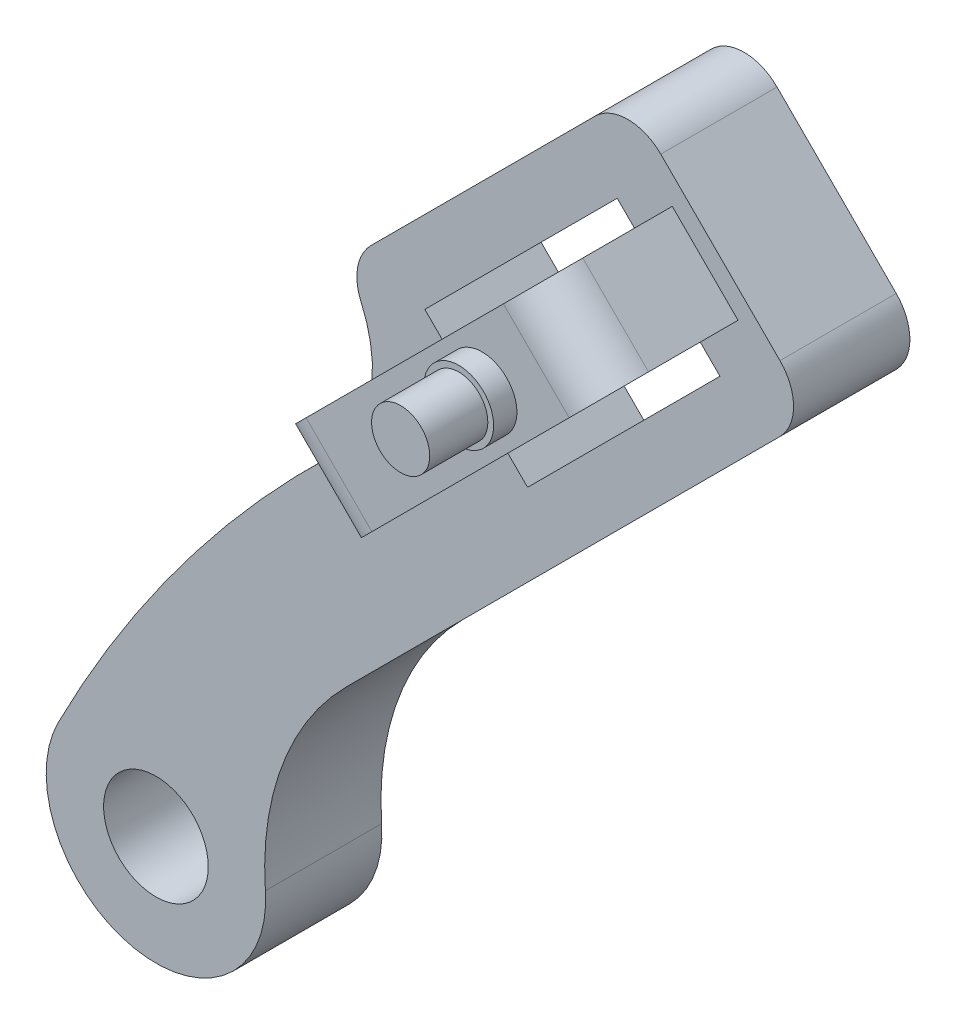
ISO-10303-21;
HEADER;
FILE_DESCRIPTION(('STEP AP214'),'2;1');
FILE_NAME('part.step','',(''),(''),'','','');
FILE_SCHEMA(('AUTOMOTIVE_DESIGN { 1 0 10303 214 1 1 1 1 }'));
ENDSEC;
DATA;
#1=APPLICATION_CONTEXT('core data for automotive mechanical design processes');
#2=APPLICATION_PROTOCOL_DEFINITION('international standard','automotive_design',2000,#1);
#3=PRODUCT_CONTEXT('',#1,'mechanical');
#4=PRODUCT('Part','Part','',(#3));
#5=PRODUCT_RELATED_PRODUCT_CATEGORY('part','',(#4));
#6=PRODUCT_DEFINITION_FORMATION('','',#4);
#7=PRODUCT_DEFINITION_CONTEXT('part definition',#1,'design');
#8=PRODUCT_DEFINITION('design','',#6,#7);
#9=PRODUCT_DEFINITION_SHAPE('','',#8);
#10=(LENGTH_UNIT() NAMED_UNIT(*) SI_UNIT(.MILLI.,.METRE.));
#11=(NAMED_UNIT(*) PLANE_ANGLE_UNIT() SI_UNIT($,.RADIAN.));
#12=(NAMED_UNIT(*) SI_UNIT($,.STERADIAN.) SOLID_ANGLE_UNIT());
#13=UNCERTAINTY_MEASURE_WITH_UNIT(LENGTH_MEASURE(1.E-05),#10,'distance_accuracy_value','');
#14=(GEOMETRIC_REPRESENTATION_CONTEXT(3) GLOBAL_UNCERTAINTY_ASSIGNED_CONTEXT((#13)) GLOBAL_UNIT_ASSIGNED_CONTEXT((#10,
#11,#12)) REPRESENTATION_CONTEXT('',''));
#15=CARTESIAN_POINT('',(0.,0.,0.));
#16=DIRECTION('',(0.,0.,1.));
#17=DIRECTION('',(1.,0.,0.));
#18=AXIS2_PLACEMENT_3D('',#15,#16,#17);
#19=CARTESIAN_POINT('',(24.0811143897357,-32.5956416867762,10.));
#20=DIRECTION('',(0.,0.,-1.));
#21=DIRECTION('',(-1.,0.,0.));
#22=AXIS2_PLACEMENT_3D('',#19,#20,#21);
#23=PLANE('',#22);
#24=DIRECTION('',(-0.707106781186549,0.707106781186546,0.));
#25=VECTOR('',#24,1.);
#26=CARTESIAN_POINT('',(62.9965403574552,6.31978428094345,10.));
#27=LINE('',#26,#25);
#28=CARTESIAN_POINT('',(40.784995997988,28.5313286404105,10.));
#29=VERTEX_POINT('',#28);
#30=CARTESIAN_POINT('',(35.1281417484956,34.1881828899029,10.));
#31=VERTEX_POINT('',#30);
#32=EDGE_CURVE('E56',#29,#31,#27,.T.);
#33=ORIENTED_EDGE('',*,*,#32,.F.);
#34=DIRECTION('',(-0.707106781186546,-0.707106781186549,0.));
#35=VECTOR('',#34,1.);
#36=CARTESIAN_POINT('',(1.8695700302685,-10.3840973273091,10.));
#37=LINE('',#36,#35);
#38=CARTESIAN_POINT('',(38.6636756544284,26.4100082968509,10.));
#39=VERTEX_POINT('',#38);
#40=EDGE_CURVE('E60',#29,#39,#37,.T.);
#41=ORIENTED_EDGE('',*,*,#40,.T.);
#42=DIRECTION('',(0.707106781186549,-0.707106781186546,0.));
#43=VECTOR('',#42,1.);
#44=CARTESIAN_POINT('',(60.8752200138956,4.19846393738382,10.));
#45=LINE('',#44,#43);
#46=CARTESIAN_POINT('',(33.006821404936,32.0668625463433,10.));
#47=VERTEX_POINT('',#46);
#48=EDGE_CURVE('E400',#47,#39,#45,.T.);
#49=ORIENTED_EDGE('',*,*,#48,.F.);
#50=DIRECTION('',(-0.707106781186546,-0.707106781186549,0.));
#51=VECTOR('',#50,1.);
#52=CARTESIAN_POINT('',(-3.7872842192239,-4.72724307781676,10.));
#53=LINE('',#52,#51);
#54=EDGE_CURVE('E389',#31,#47,#53,.T.);
#55=ORIENTED_EDGE('',*,*,#54,.F.);
#56=EDGE_LOOP('',(#33,#41,#49,#55));
#57=FACE_BOUND('',#56,.T.);
#58=DIRECTION('',(-0.707106781186549,0.707106781186546,0.));
#59=VECTOR('',#58,1.);
#60=CARTESIAN_POINT('',(42.4904437030454,-14.1863123734665,10.));
#61=LINE('',#60,#59);
#62=CARTESIAN_POINT('',(20.2788993435782,8.02523198600063,10.));
#63=VERTEX_POINT('',#62);
#64=CARTESIAN_POINT('',(14.6220450940858,13.682086235493,10.));
#65=VERTEX_POINT('',#64);
#66=EDGE_CURVE('E388',#63,#65,#61,.T.);
#67=ORIENTED_EDGE('',*,*,#66,.F.);
#68=CARTESIAN_POINT('',(18.1575790000185,5.90391164244098,10.));
#69=VERTEX_POINT('',#68);
#70=EDGE_CURVE('E397',#63,#69,#37,.T.);
#71=ORIENTED_EDGE('',*,*,#70,.T.);
#72=DIRECTION('',(0.707106781186549,-0.707106781186546,0.));
#73=VECTOR('',#72,1.);
#74=CARTESIAN_POINT('',(40.3691233594857,-16.3076327170261,10.));
#75=LINE('',#74,#73);
#76=CARTESIAN_POINT('',(12.5007247505261,11.5607658919333,10.));
#77=VERTEX_POINT('',#76);
#78=EDGE_CURVE('E393',#77,#69,#75,.T.);
#79=ORIENTED_EDGE('',*,*,#78,.F.);
#80=EDGE_CURVE('E384',#65,#77,#53,.T.);
#81=ORIENTED_EDGE('',*,*,#80,.F.);
#82=EDGE_LOOP('',(#67,#71,#79,#81));
#83=FACE_BOUND('',#82,.T.);
#84=CARTESIAN_POINT('',(24.0811143897357,-32.5956416867762,10.));
#85=DIRECTION('',(0.,0.,-1.));
#86=DIRECTION('',(-1.,0.,0.));
#87=AXIS2_PLACEMENT_3D('',#84,#85,#86);
#88=CIRCLE('',#87,24.0118672744103);
#89=CARTESIAN_POINT('',(0.129369861392694,-34.2937889280073,10.));
#90=VERTEX_POINT('',#89);
#91=CARTESIAN_POINT('',(7.10216021104856,-15.61668750809,10.));
#92=VERTEX_POINT('',#91);
#93=EDGE_CURVE('E283',#90,#92,#88,.T.);
#94=ORIENTED_EDGE('',*,*,#93,.T.);
#95=DIRECTION('',(0.707106781186546,0.707106781186549,0.));
#96=VECTOR('',#95,1.);
#97=CARTESIAN_POINT('',(7.10216021104856,-15.61668750809,10.));
#98=LINE('',#97,#96);
#99=CARTESIAN_POINT('',(44.3912405820395,21.6723928629011,10.));
#100=VERTEX_POINT('',#99);
#101=EDGE_CURVE('E287',#92,#100,#98,.T.);
#102=ORIENTED_EDGE('',*,*,#101,.T.);
#103=CARTESIAN_POINT('',(41.5628134572933,24.5008199876474,10.));
#104=DIRECTION('',(0.,0.,1.));
#105=DIRECTION('',(1.,0.,0.));
#106=AXIS2_PLACEMENT_3D('',#103,#104,#105);
#107=CIRCLE('',#106,3.9999999999999);
#108=CARTESIAN_POINT('',(44.3912405820395,27.3292471123935,10.));
#109=VERTEX_POINT('',#108);
#110=EDGE_CURVE('E291',#100,#109,#107,.T.);
#111=ORIENTED_EDGE('',*,*,#110,.T.);
#112=DIRECTION('',(-0.707106781186549,0.707106781186546,0.));
#113=VECTOR('',#112,1.);
#114=CARTESIAN_POINT('',(44.3912405820394,27.3292471123934,10.));
#115=LINE('',#114,#113);
#116=CARTESIAN_POINT('',(34.1381922548344,37.5822954395984,10.));
#117=VERTEX_POINT('',#116);
#118=EDGE_CURVE('E294',#109,#117,#115,.T.);
#119=ORIENTED_EDGE('',*,*,#118,.T.);
#120=CARTESIAN_POINT('',(31.3097651300883,34.7538683148522,10.));
#121=DIRECTION('',(0.,0.,1.));
#122=DIRECTION('',(1.,0.,0.));
#123=AXIS2_PLACEMENT_3D('',#120,#121,#122);
#124=CIRCLE('',#123,3.99999999999996);
#125=CARTESIAN_POINT('',(28.481338005342,37.5822954395983,10.));
#126=VERTEX_POINT('',#125);
#127=EDGE_CURVE('E297',#117,#126,#124,.T.);
#128=ORIENTED_EDGE('',*,*,#127,.T.);
#129=DIRECTION('',(-0.707106781186546,-0.707106781186549,0.));
#130=VECTOR('',#129,1.);
#131=CARTESIAN_POINT('',(28.481338005342,37.5822954395983,10.));
#132=LINE('',#131,#130);
#133=CARTESIAN_POINT('',(9.21539039948496,18.3163478337412,10.));
#134=VERTEX_POINT('',#133);
#135=EDGE_CURVE('E300',#126,#134,#132,.T.);
#136=ORIENTED_EDGE('',*,*,#135,.T.);
#137=CARTESIAN_POINT('',(12.1521017138168,15.3796365194093,10.));
#138=DIRECTION('',(0.,0.,1.));
#139=DIRECTION('',(1.,0.,0.));
#140=AXIS2_PLACEMENT_3D('',#137,#138,#139);
#141=CIRCLE('',#140,4.15313696950266);
#142=CARTESIAN_POINT('',(8.36213667163491,13.6811926238129,10.));
#143=VERTEX_POINT('',#142);
#144=EDGE_CURVE('E303',#134,#143,#141,.T.);
#145=ORIENTED_EDGE('',*,*,#144,.T.);
#146=CARTESIAN_POINT('',(-1.86752605487324,9.09684738092259,10.));
#147=DIRECTION('',(0.,0.,-1.));
#148=DIRECTION('',(-1.,0.,0.));
#149=AXIS2_PLACEMENT_3D('',#146,#147,#148);
#150=CIRCLE('',#149,11.2099161818509);
#151=CARTESIAN_POINT('',(5.88617447944661,1.00102445621569,10.));
#152=VERTEX_POINT('',#151);
#153=EDGE_CURVE('E306',#143,#152,#150,.T.);
#154=ORIENTED_EDGE('',*,*,#153,.T.);
#155=CARTESIAN_POINT('',(87.9841446707318,-84.7194165389705,10.));
#156=DIRECTION('',(0.,0.,1.));
#157=DIRECTION('',(1.,0.,0.));
#158=AXIS2_PLACEMENT_3D('',#155,#156,#157);
#159=CIRCLE('',#158,118.693178885471);
#160=CARTESIAN_POINT('',(-17.6852254719046,-30.6633814679737,10.));
#161=VERTEX_POINT('',#160);
#162=EDGE_CURVE('E309',#152,#161,#159,.T.);
#163=ORIENTED_EDGE('',*,*,#162,.T.);
#164=CARTESIAN_POINT('',(-9.28385052519776,-34.9611738949632,10.));
#165=DIRECTION('',(0.,0.,1.));
#166=DIRECTION('',(1.,0.,0.));
#167=AXIS2_PLACEMENT_3D('',#164,#165,#166);
#168=CIRCLE('',#167,9.43684908964008);
#169=EDGE_CURVE('E312',#161,#90,#168,.T.);
#170=ORIENTED_EDGE('',*,*,#169,.T.);
#171=EDGE_LOOP('',(#94,#102,#111,#119,#128,#136,#145,#154,#163,#170));
#172=FACE_BOUND('',#171,.T.);
#173=DIRECTION('',(-0.707106781186549,0.707106781186546,0.));
#174=VECTOR('',#173,1.);
#175=CARTESIAN_POINT('',(39.2293610793776,23.5815811721047,10.));
#176=LINE('',#175,#174);
#177=CARTESIAN_POINT('',(39.2293610793776,23.5815811721047,10.));
#178=VERTEX_POINT('',#177);
#179=CARTESIAN_POINT('',(30.3905263145457,32.4204159369365,10.));
#180=VERTEX_POINT('',#179);
#181=EDGE_CURVE('E240',#178,#180,#176,.T.);
#182=ORIENTED_EDGE('',*,*,#181,.F.);
#183=DIRECTION('',(0.707106781186546,0.707106781186549,0.));
#184=VECTOR('',#183,1.);
#185=CARTESIAN_POINT('',(39.2293610793776,23.5815811721047,10.));
#186=LINE('',#185,#184);
#187=CARTESIAN_POINT('',(22.6830623996124,7.03528249233946,10.));
#188=VERTEX_POINT('',#187);
#189=EDGE_CURVE('E251',#188,#178,#186,.T.);
#190=ORIENTED_EDGE('',*,*,#189,.F.);
#191=DIRECTION('',(0.707106781186549,-0.707106781186546,0.));
#192=VECTOR('',#191,1.);
#193=CARTESIAN_POINT('',(22.6830623996124,7.03528249233946,10.));
#194=LINE('',#193,#192);
#195=CARTESIAN_POINT('',(13.8442276347806,15.8741172571713,10.));
#196=VERTEX_POINT('',#195);
#197=EDGE_CURVE('E247',#196,#188,#194,.T.);
#198=ORIENTED_EDGE('',*,*,#197,.F.);
#199=DIRECTION('',(-0.707106781186546,-0.707106781186549,0.));
#200=VECTOR('',#199,1.);
#201=CARTESIAN_POINT('',(30.3905263145457,32.4204159369365,10.));
#202=LINE('',#201,#200);
#203=EDGE_CURVE('E243',#180,#196,#202,.T.);
#204=ORIENTED_EDGE('',*,*,#203,.F.);
#205=EDGE_LOOP('',(#182,#190,#198,#204));
#206=FACE_BOUND('',#205,.T.);
#207=CARTESIAN_POINT('',(-9.28385052519776,-34.9611738949632,10.));
#208=DIRECTION('',(0.,0.,1.));
#209=DIRECTION('',(1.,0.,0.));
#210=AXIS2_PLACEMENT_3D('',#207,#208,#209);
#211=CIRCLE('',#210,4.5);
#212=CARTESIAN_POINT('',(-4.78385052519776,-34.9611738949632,10.));
#213=VERTEX_POINT('',#212);
#214=EDGE_CURVE('E230',#213,#213,#211,.T.);
#215=ORIENTED_EDGE('',*,*,#214,.F.);
#216=EDGE_LOOP('',(#215));
#217=FACE_BOUND('',#216,.T.);
#218=ADVANCED_FACE('F39',(#57,#83,#172,#206,#217),#23,.F.);
#219=CARTESIAN_POINT('',(24.0811143897357,-32.5956416867762,0.));
#220=DIRECTION('',(0.,0.,-1.));
#221=DIRECTION('',(-1.,0.,0.));
#222=AXIS2_PLACEMENT_3D('',#219,#220,#221);
#223=PLANE('',#222);
#224=CARTESIAN_POINT('',(16.3544567079928,9.75764359990769,0.));
#225=DIRECTION('',(0.,0.,-1.));
#226=DIRECTION('',(-1.,0.,0.));
#227=AXIS2_PLACEMENT_3D('',#224,#225,#226);
#228=CIRCLE('',#227,0.800000000000001);
#229=CARTESIAN_POINT('',(15.5544567079928,9.75764359990769,0.));
#230=VERTEX_POINT('',#229);
#231=EDGE_CURVE('E878',#230,#230,#228,.T.);
#232=ORIENTED_EDGE('',*,*,#231,.F.);
#233=EDGE_LOOP('',(#232));
#234=FACE_BOUND('',#233,.T.);
#235=CARTESIAN_POINT('',(36.5069999718094,29.9101868637243,0.));
#236=DIRECTION('',(0.,0.,-1.));
#237=DIRECTION('',(-1.,0.,0.));
#238=AXIS2_PLACEMENT_3D('',#235,#236,#237);
#239=CIRCLE('',#238,0.800000000000003);
#240=CARTESIAN_POINT('',(35.7069999718094,29.9101868637243,0.));
#241=VERTEX_POINT('',#240);
#242=EDGE_CURVE('E872',#241,#241,#239,.T.);
#243=ORIENTED_EDGE('',*,*,#242,.F.);
#244=EDGE_LOOP('',(#243));
#245=FACE_BOUND('',#244,.T.);
#246=DIRECTION('',(0.707106781186546,0.707106781186549,0.));
#247=VECTOR('',#246,1.);
#248=CARTESIAN_POINT('',(39.2293610793776,23.5815811721047,0.));
#249=LINE('',#248,#247);
#250=CARTESIAN_POINT('',(22.6830623996124,7.03528249233946,0.));
#251=VERTEX_POINT('',#250);
#252=CARTESIAN_POINT('',(39.2293610793776,23.5815811721047,0.));
#253=VERTEX_POINT('',#252);
#254=EDGE_CURVE('E244',#251,#253,#249,.T.);
#255=ORIENTED_EDGE('',*,*,#254,.T.);
#256=DIRECTION('',(-0.707106781186549,0.707106781186546,0.));
#257=VECTOR('',#256,1.);
#258=CARTESIAN_POINT('',(39.2293610793776,23.5815811721047,0.));
#259=LINE('',#258,#257);
#260=CARTESIAN_POINT('',(30.3905263145457,32.4204159369365,0.));
#261=VERTEX_POINT('',#260);
#262=EDGE_CURVE('E238',#253,#261,#259,.T.);
#263=ORIENTED_EDGE('',*,*,#262,.T.);
#264=DIRECTION('',(-0.707106781186546,-0.707106781186549,0.));
#265=VECTOR('',#264,1.);
#266=CARTESIAN_POINT('',(30.3905263145457,32.4204159369365,0.));
#267=LINE('',#266,#265);
#268=CARTESIAN_POINT('',(13.8442276347806,15.8741172571713,0.));
#269=VERTEX_POINT('',#268);
#270=EDGE_CURVE('E258',#261,#269,#267,.T.);
#271=ORIENTED_EDGE('',*,*,#270,.T.);
#272=DIRECTION('',(0.707106781186549,-0.707106781186546,0.));
#273=VECTOR('',#272,1.);
#274=CARTESIAN_POINT('',(22.6830623996124,7.03528249233946,0.));
#275=LINE('',#274,#273);
#276=EDGE_CURVE('E262',#269,#251,#275,.T.);
#277=ORIENTED_EDGE('',*,*,#276,.T.);
#278=EDGE_LOOP('',(#255,#263,#271,#277));
#279=FACE_BOUND('',#278,.T.);
#280=CARTESIAN_POINT('',(24.0811143897357,-32.5956416867762,0.));
#281=DIRECTION('',(0.,0.,-1.));
#282=DIRECTION('',(-1.,0.,0.));
#283=AXIS2_PLACEMENT_3D('',#280,#281,#282);
#284=CIRCLE('',#283,24.0118672744103);
#285=CARTESIAN_POINT('',(0.129369861392694,-34.2937889280073,0.));
#286=VERTEX_POINT('',#285);
#287=CARTESIAN_POINT('',(7.10216021104856,-15.61668750809,0.));
#288=VERTEX_POINT('',#287);
#289=EDGE_CURVE('E282',#286,#288,#284,.T.);
#290=ORIENTED_EDGE('',*,*,#289,.F.);
#291=CARTESIAN_POINT('',(-9.28385052519776,-34.9611738949632,0.));
#292=DIRECTION('',(0.,0.,1.));
#293=DIRECTION('',(1.,0.,0.));
#294=AXIS2_PLACEMENT_3D('',#291,#292,#293);
#295=CIRCLE('',#294,9.43684908964008);
#296=CARTESIAN_POINT('',(-17.6852254719046,-30.6633814679737,0.));
#297=VERTEX_POINT('',#296);
#298=EDGE_CURVE('E288',#297,#286,#295,.T.);
#299=ORIENTED_EDGE('',*,*,#298,.F.);
#300=CARTESIAN_POINT('',(87.9841446707318,-84.7194165389705,0.));
#301=DIRECTION('',(0.,0.,1.));
#302=DIRECTION('',(1.,0.,0.));
#303=AXIS2_PLACEMENT_3D('',#300,#301,#302);
#304=CIRCLE('',#303,118.693178885471);
#305=CARTESIAN_POINT('',(5.88617447944661,1.00102445621569,0.));
#306=VERTEX_POINT('',#305);
#307=EDGE_CURVE('E340',#306,#297,#304,.T.);
#308=ORIENTED_EDGE('',*,*,#307,.F.);
#309=CARTESIAN_POINT('',(-1.86752605487324,9.09684738092259,0.));
#310=DIRECTION('',(0.,0.,-1.));
#311=DIRECTION('',(-1.,0.,0.));
#312=AXIS2_PLACEMENT_3D('',#309,#310,#311);
#313=CIRCLE('',#312,11.2099161818509);
#314=CARTESIAN_POINT('',(8.36213667163491,13.6811926238129,0.));
#315=VERTEX_POINT('',#314);
#316=EDGE_CURVE('E337',#315,#306,#313,.T.);
#317=ORIENTED_EDGE('',*,*,#316,.F.);
#318=CARTESIAN_POINT('',(12.1521017138168,15.3796365194093,0.));
#319=DIRECTION('',(0.,0.,1.));
#320=DIRECTION('',(1.,0.,0.));
#321=AXIS2_PLACEMENT_3D('',#318,#319,#320);
#322=CIRCLE('',#321,4.15313696950266);
#323=CARTESIAN_POINT('',(9.21539039948496,18.3163478337412,0.));
#324=VERTEX_POINT('',#323);
#325=EDGE_CURVE('E334',#324,#315,#322,.T.);
#326=ORIENTED_EDGE('',*,*,#325,.F.);
#327=DIRECTION('',(-0.707106781186546,-0.707106781186549,0.));
#328=VECTOR('',#327,1.);
#329=CARTESIAN_POINT('',(28.481338005342,37.5822954395983,0.));
#330=LINE('',#329,#328);
#331=CARTESIAN_POINT('',(28.481338005342,37.5822954395983,0.));
#332=VERTEX_POINT('',#331);
#333=EDGE_CURVE('E331',#332,#324,#330,.T.);
#334=ORIENTED_EDGE('',*,*,#333,.F.);
#335=CARTESIAN_POINT('',(31.3097651300883,34.7538683148522,0.));
#336=DIRECTION('',(0.,0.,1.));
#337=DIRECTION('',(1.,0.,0.));
#338=AXIS2_PLACEMENT_3D('',#335,#336,#337);
#339=CIRCLE('',#338,3.99999999999996);
#340=CARTESIAN_POINT('',(34.1381922548344,37.5822954395984,0.));
#341=VERTEX_POINT('',#340);
#342=EDGE_CURVE('E328',#341,#332,#339,.T.);
#343=ORIENTED_EDGE('',*,*,#342,.F.);
#344=DIRECTION('',(-0.707106781186549,0.707106781186546,0.));
#345=VECTOR('',#344,1.);
#346=CARTESIAN_POINT('',(44.3912405820394,27.3292471123934,0.));
#347=LINE('',#346,#345);
#348=CARTESIAN_POINT('',(44.3912405820395,27.3292471123935,0.));
#349=VERTEX_POINT('',#348);
#350=EDGE_CURVE('E325',#349,#341,#347,.T.);
#351=ORIENTED_EDGE('',*,*,#350,.F.);
#352=CARTESIAN_POINT('',(41.5628134572933,24.5008199876474,0.));
#353=DIRECTION('',(0.,0.,1.));
#354=DIRECTION('',(1.,0.,0.));
#355=AXIS2_PLACEMENT_3D('',#352,#353,#354);
#356=CIRCLE('',#355,3.9999999999999);
#357=CARTESIAN_POINT('',(44.3912405820395,21.6723928629011,0.));
#358=VERTEX_POINT('',#357);
#359=EDGE_CURVE('E322',#358,#349,#356,.T.);
#360=ORIENTED_EDGE('',*,*,#359,.F.);
#361=DIRECTION('',(0.707106781186546,0.707106781186549,0.));
#362=VECTOR('',#361,1.);
#363=CARTESIAN_POINT('',(7.10216021104856,-15.61668750809,0.));
#364=LINE('',#363,#362);
#365=EDGE_CURVE('E319',#288,#358,#364,.T.);
#366=ORIENTED_EDGE('',*,*,#365,.F.);
#367=EDGE_LOOP('',(#290,#299,#308,#317,#326,#334,#343,#351,#360,#366));
#368=FACE_BOUND('',#367,.T.);
#369=CARTESIAN_POINT('',(-9.28385052519776,-34.9611738949632,0.));
#370=DIRECTION('',(0.,0.,1.));
#371=DIRECTION('',(1.,0.,0.));
#372=AXIS2_PLACEMENT_3D('',#369,#370,#371);
#373=CIRCLE('',#372,4.5);
#374=CARTESIAN_POINT('',(-4.78385052519776,-34.9611738949632,0.));
#375=VERTEX_POINT('',#374);
#376=EDGE_CURVE('E225',#375,#375,#373,.T.);
#377=ORIENTED_EDGE('',*,*,#376,.T.);
#378=EDGE_LOOP('',(#377));
#379=FACE_BOUND('',#378,.T.);
#380=ADVANCED_FACE('F503',(#234,#245,#279,#368,#379),#223,.T.);
#381=CARTESIAN_POINT('',(24.0811143897357,-32.5956416867762,10.));
#382=DIRECTION('',(0.,0.,-1.));
#383=DIRECTION('',(-1.,0.,0.));
#384=AXIS2_PLACEMENT_3D('',#381,#382,#383);
#385=CYLINDRICAL_SURFACE('',#384,24.0118672744103);
#386=ORIENTED_EDGE('',*,*,#289,.T.);
#387=DIRECTION('',(0.,0.,-1.));
#388=VECTOR('',#387,1.);
#389=CARTESIAN_POINT('',(7.10216021104856,-15.61668750809,10.));
#390=LINE('',#389,#388);
#391=EDGE_CURVE('E380',#92,#288,#390,.T.);
#392=ORIENTED_EDGE('',*,*,#391,.F.);
#393=ORIENTED_EDGE('',*,*,#93,.F.);
#394=DIRECTION('',(0.,0.,-1.));
#395=VECTOR('',#394,1.);
#396=CARTESIAN_POINT('',(0.129369861392694,-34.2937889280073,10.));
#397=LINE('',#396,#395);
#398=EDGE_CURVE('E315',#90,#286,#397,.T.);
#399=ORIENTED_EDGE('',*,*,#398,.T.);
#400=EDGE_LOOP('',(#386,#392,#393,#399));
#401=FACE_BOUND('',#400,.T.);
#402=ADVANCED_FACE('F41',(#401),#385,.F.);
#403=CARTESIAN_POINT('',(7.10216021104856,-15.61668750809,10.));
#404=DIRECTION('',(-0.707106781186549,0.707106781186546,0.));
#405=DIRECTION('',(-0.707106781186546,-0.707106781186549,0.));
#406=AXIS2_PLACEMENT_3D('',#403,#404,#405);
#407=PLANE('',#406);
#408=ORIENTED_EDGE('',*,*,#365,.T.);
#409=DIRECTION('',(0.,0.,-1.));
#410=VECTOR('',#409,1.);
#411=CARTESIAN_POINT('',(44.3912405820395,21.6723928629011,10.));
#412=LINE('',#411,#410);
#413=EDGE_CURVE('E376',#100,#358,#412,.T.);
#414=ORIENTED_EDGE('',*,*,#413,.F.);
#415=ORIENTED_EDGE('',*,*,#101,.F.);
#416=ORIENTED_EDGE('',*,*,#391,.T.);
#417=EDGE_LOOP('',(#408,#414,#415,#416));
#418=FACE_BOUND('',#417,.T.);
#419=ADVANCED_FACE('F527',(#418),#407,.F.);
#420=CARTESIAN_POINT('',(41.5628134572933,24.5008199876474,10.));
#421=DIRECTION('',(0.,0.,-1.));
#422=DIRECTION('',(-1.,0.,0.));
#423=AXIS2_PLACEMENT_3D('',#420,#421,#422);
#424=CYLINDRICAL_SURFACE('',#423,3.9999999999999);
#425=ORIENTED_EDGE('',*,*,#359,.T.);
#426=DIRECTION('',(0.,0.,-1.));
#427=VECTOR('',#426,1.);
#428=CARTESIAN_POINT('',(44.3912405820395,27.3292471123935,10.));
#429=LINE('',#428,#427);
#430=EDGE_CURVE('E372',#109,#349,#429,.T.);
#431=ORIENTED_EDGE('',*,*,#430,.F.);
#432=ORIENTED_EDGE('',*,*,#110,.F.);
#433=ORIENTED_EDGE('',*,*,#413,.T.);
#434=EDGE_LOOP('',(#425,#431,#432,#433));
#435=FACE_BOUND('',#434,.T.);
#436=ADVANCED_FACE('F561',(#435),#424,.T.);
#437=CARTESIAN_POINT('',(44.3912405820394,27.3292471123934,10.));
#438=DIRECTION('',(-0.707106781186546,-0.707106781186549,0.));
#439=DIRECTION('',(0.707106781186549,-0.707106781186546,0.));
#440=AXIS2_PLACEMENT_3D('',#437,#438,#439);
#441=PLANE('',#440);
#442=ORIENTED_EDGE('',*,*,#350,.T.);
#443=DIRECTION('',(0.,0.,-1.));
#444=VECTOR('',#443,1.);
#445=CARTESIAN_POINT('',(34.1381922548344,37.5822954395984,10.));
#446=LINE('',#445,#444);
#447=EDGE_CURVE('E368',#117,#341,#446,.T.);
#448=ORIENTED_EDGE('',*,*,#447,.F.);
#449=ORIENTED_EDGE('',*,*,#118,.F.);
#450=ORIENTED_EDGE('',*,*,#430,.T.);
#451=EDGE_LOOP('',(#442,#448,#449,#450));
#452=FACE_BOUND('',#451,.T.);
#453=ADVANCED_FACE('F557',(#452),#441,.F.);
#454=CARTESIAN_POINT('',(31.3097651300883,34.7538683148522,10.));
#455=DIRECTION('',(0.,0.,-1.));
#456=DIRECTION('',(-1.,0.,0.));
#457=AXIS2_PLACEMENT_3D('',#454,#455,#456);
#458=CYLINDRICAL_SURFACE('',#457,3.99999999999996);
#459=ORIENTED_EDGE('',*,*,#342,.T.);
#460=DIRECTION('',(0.,0.,-1.));
#461=VECTOR('',#460,1.);
#462=CARTESIAN_POINT('',(28.481338005342,37.5822954395983,10.));
#463=LINE('',#462,#461);
#464=EDGE_CURVE('E364',#126,#332,#463,.T.);
#465=ORIENTED_EDGE('',*,*,#464,.F.);
#466=ORIENTED_EDGE('',*,*,#127,.F.);
#467=ORIENTED_EDGE('',*,*,#447,.T.);
#468=EDGE_LOOP('',(#459,#465,#466,#467));
#469=FACE_BOUND('',#468,.T.);
#470=ADVANCED_FACE('F553',(#469),#458,.T.);
#471=CARTESIAN_POINT('',(28.481338005342,37.5822954395983,10.));
#472=DIRECTION('',(0.707106781186549,-0.707106781186546,0.));
#473=DIRECTION('',(0.707106781186546,0.707106781186549,0.));
#474=AXIS2_PLACEMENT_3D('',#471,#472,#473);
#475=PLANE('',#474);
#476=ORIENTED_EDGE('',*,*,#333,.T.);
#477=DIRECTION('',(0.,0.,-1.));
#478=VECTOR('',#477,1.);
#479=CARTESIAN_POINT('',(9.21539039948496,18.3163478337412,10.));
#480=LINE('',#479,#478);
#481=EDGE_CURVE('E360',#134,#324,#480,.T.);
#482=ORIENTED_EDGE('',*,*,#481,.F.);
#483=ORIENTED_EDGE('',*,*,#135,.F.);
#484=ORIENTED_EDGE('',*,*,#464,.T.);
#485=EDGE_LOOP('',(#476,#482,#483,#484));
#486=FACE_BOUND('',#485,.T.);
#487=ADVANCED_FACE('F549',(#486),#475,.F.);
#488=CARTESIAN_POINT('',(12.1521017138168,15.3796365194093,10.));
#489=DIRECTION('',(0.,0.,-1.));
#490=DIRECTION('',(-1.,0.,0.));
#491=AXIS2_PLACEMENT_3D('',#488,#489,#490);
#492=CYLINDRICAL_SURFACE('',#491,4.15313696950266);
#493=ORIENTED_EDGE('',*,*,#325,.T.);
#494=DIRECTION('',(0.,0.,-1.));
#495=VECTOR('',#494,1.);
#496=CARTESIAN_POINT('',(8.36213667163491,13.6811926238129,10.));
#497=LINE('',#496,#495);
#498=EDGE_CURVE('E356',#143,#315,#497,.T.);
#499=ORIENTED_EDGE('',*,*,#498,.F.);
#500=ORIENTED_EDGE('',*,*,#144,.F.);
#501=ORIENTED_EDGE('',*,*,#481,.T.);
#502=EDGE_LOOP('',(#493,#499,#500,#501));
#503=FACE_BOUND('',#502,.T.);
#504=ADVANCED_FACE('F545',(#503),#492,.T.);
#505=CARTESIAN_POINT('',(-1.86752605487324,9.09684738092259,10.));
#506=DIRECTION('',(0.,0.,-1.));
#507=DIRECTION('',(-1.,0.,0.));
#508=AXIS2_PLACEMENT_3D('',#505,#506,#507);
#509=CYLINDRICAL_SURFACE('',#508,11.2099161818509);
#510=ORIENTED_EDGE('',*,*,#316,.T.);
#511=DIRECTION('',(0.,0.,-1.));
#512=VECTOR('',#511,1.);
#513=CARTESIAN_POINT('',(5.88617447944661,1.00102445621569,10.));
#514=LINE('',#513,#512);
#515=EDGE_CURVE('E352',#152,#306,#514,.T.);
#516=ORIENTED_EDGE('',*,*,#515,.F.);
#517=ORIENTED_EDGE('',*,*,#153,.F.);
#518=ORIENTED_EDGE('',*,*,#498,.T.);
#519=EDGE_LOOP('',(#510,#516,#517,#518));
#520=FACE_BOUND('',#519,.T.);
#521=ADVANCED_FACE('F541',(#520),#509,.F.);
#522=CARTESIAN_POINT('',(87.9841446707318,-84.7194165389705,10.));
#523=DIRECTION('',(0.,0.,-1.));
#524=DIRECTION('',(-1.,0.,0.));
#525=AXIS2_PLACEMENT_3D('',#522,#523,#524);
#526=CYLINDRICAL_SURFACE('',#525,118.693178885471);
#527=ORIENTED_EDGE('',*,*,#307,.T.);
#528=DIRECTION('',(0.,0.,-1.));
#529=VECTOR('',#528,1.);
#530=CARTESIAN_POINT('',(-17.6852254719046,-30.6633814679737,10.));
#531=LINE('',#530,#529);
#532=EDGE_CURVE('E348',#161,#297,#531,.T.);
#533=ORIENTED_EDGE('',*,*,#532,.F.);
#534=ORIENTED_EDGE('',*,*,#162,.F.);
#535=ORIENTED_EDGE('',*,*,#515,.T.);
#536=EDGE_LOOP('',(#527,#533,#534,#535));
#537=FACE_BOUND('',#536,.T.);
#538=ADVANCED_FACE('F537',(#537),#526,.T.);
#539=CARTESIAN_POINT('',(-9.28385052519776,-34.9611738949632,10.));
#540=DIRECTION('',(0.,0.,-1.));
#541=DIRECTION('',(-1.,0.,0.));
#542=AXIS2_PLACEMENT_3D('',#539,#540,#541);
#543=CYLINDRICAL_SURFACE('',#542,9.43684908964008);
#544=ORIENTED_EDGE('',*,*,#298,.T.);
#545=ORIENTED_EDGE('',*,*,#398,.F.);
#546=ORIENTED_EDGE('',*,*,#169,.F.);
#547=ORIENTED_EDGE('',*,*,#532,.T.);
#548=EDGE_LOOP('',(#544,#545,#546,#547));
#549=FACE_BOUND('',#548,.T.);
#550=ADVANCED_FACE('F533',(#549),#543,.T.);
#551=CARTESIAN_POINT('',(39.2293610793776,23.5815811721047,10.));
#552=DIRECTION('',(-0.707106781186546,-0.707106781186549,0.));
#553=DIRECTION('',(0.707106781186549,-0.707106781186546,0.));
#554=AXIS2_PLACEMENT_3D('',#551,#552,#553);
#555=PLANE('',#554);
#556=ORIENTED_EDGE('',*,*,#262,.F.);
#557=DIRECTION('',(0.,0.,-1.));
#558=VECTOR('',#557,1.);
#559=CARTESIAN_POINT('',(39.2293610793776,23.5815811721047,10.));
#560=LINE('',#559,#558);
#561=EDGE_CURVE('E254',#178,#253,#560,.T.);
#562=ORIENTED_EDGE('',*,*,#561,.F.);
#563=ORIENTED_EDGE('',*,*,#181,.T.);
#564=DIRECTION('',(0.,0.,-1.));
#565=VECTOR('',#564,1.);
#566=CARTESIAN_POINT('',(30.3905263145457,32.4204159369365,10.));
#567=LINE('',#566,#565);
#568=EDGE_CURVE('E278',#180,#261,#567,.T.);
#569=ORIENTED_EDGE('',*,*,#568,.T.);
#570=EDGE_LOOP('',(#556,#562,#563,#569));
#571=FACE_BOUND('',#570,.T.);
#572=ADVANCED_FACE('F536',(#571),#555,.T.);
#573=CARTESIAN_POINT('',(30.3905263145457,32.4204159369365,10.));
#574=DIRECTION('',(0.707106781186549,-0.707106781186546,0.));
#575=DIRECTION('',(0.707106781186546,0.707106781186549,0.));
#576=AXIS2_PLACEMENT_3D('',#573,#574,#575);
#577=PLANE('',#576);
#578=ORIENTED_EDGE('',*,*,#270,.F.);
#579=ORIENTED_EDGE('',*,*,#568,.F.);
#580=ORIENTED_EDGE('',*,*,#203,.T.);
#581=DIRECTION('',(0.,0.,-1.));
#582=VECTOR('',#581,1.);
#583=CARTESIAN_POINT('',(13.8442276347806,15.8741172571713,10.));
#584=LINE('',#583,#582);
#585=EDGE_CURVE('E275',#196,#269,#584,.T.);
#586=ORIENTED_EDGE('',*,*,#585,.T.);
#587=EDGE_LOOP('',(#578,#579,#580,#586));
#588=FACE_BOUND('',#587,.T.);
#589=ADVANCED_FACE('F636',(#588),#577,.T.);
#590=CARTESIAN_POINT('',(22.6830623996124,7.03528249233946,10.));
#591=DIRECTION('',(0.707106781186546,0.707106781186549,0.));
#592=DIRECTION('',(-0.707106781186549,0.707106781186546,0.));
#593=AXIS2_PLACEMENT_3D('',#590,#591,#592);
#594=PLANE('',#593);
#595=ORIENTED_EDGE('',*,*,#276,.F.);
#596=ORIENTED_EDGE('',*,*,#585,.F.);
#597=ORIENTED_EDGE('',*,*,#197,.T.);
#598=DIRECTION('',(0.,0.,-1.));
#599=VECTOR('',#598,1.);
#600=CARTESIAN_POINT('',(22.6830623996124,7.03528249233946,10.));
#601=LINE('',#600,#599);
#602=EDGE_CURVE('E272',#188,#251,#601,.T.);
#603=ORIENTED_EDGE('',*,*,#602,.T.);
#604=EDGE_LOOP('',(#595,#596,#597,#603));
#605=FACE_BOUND('',#604,.T.);
#606=ADVANCED_FACE('F643',(#605),#594,.T.);
#607=CARTESIAN_POINT('',(39.2293610793776,23.5815811721047,10.));
#608=DIRECTION('',(-0.707106781186549,0.707106781186546,0.));
#609=DIRECTION('',(-0.707106781186546,-0.707106781186549,0.));
#610=AXIS2_PLACEMENT_3D('',#607,#608,#609);
#611=PLANE('',#610);
#612=ORIENTED_EDGE('',*,*,#254,.F.);
#613=ORIENTED_EDGE('',*,*,#602,.F.);
#614=ORIENTED_EDGE('',*,*,#189,.T.);
#615=ORIENTED_EDGE('',*,*,#561,.T.);
#616=EDGE_LOOP('',(#612,#613,#614,#615));
#617=FACE_BOUND('',#616,.T.);
#618=ADVANCED_FACE('F517',(#617),#611,.T.);
#619=CARTESIAN_POINT('',(-9.28385052519776,-34.9611738949632,10.));
#620=DIRECTION('',(0.,0.,-1.));
#621=DIRECTION('',(-1.,0.,0.));
#622=AXIS2_PLACEMENT_3D('',#619,#620,#621);
#623=CYLINDRICAL_SURFACE('',#622,4.5);
#624=ORIENTED_EDGE('',*,*,#214,.T.);
#625=EDGE_LOOP('',(#624));
#626=FACE_BOUND('',#625,.T.);
#627=ORIENTED_EDGE('',*,*,#376,.F.);
#628=EDGE_LOOP('',(#627));
#629=FACE_BOUND('',#628,.T.);
#630=ADVANCED_FACE('F514',(#626,#629),#623,.F.);
#631=CARTESIAN_POINT('',(40.784995997988,28.5313286404105,9.69739797942992));
#632=DIRECTION('',(-0.707106781186546,-0.707106781186549,0.));
#633=DIRECTION('',(0.707106781186549,-0.707106781186546,0.));
#634=AXIS2_PLACEMENT_3D('',#631,#632,#633);
#635=PLANE('',#634);
#636=DIRECTION('',(0.,0.,1.));
#637=VECTOR('',#636,1.);
#638=CARTESIAN_POINT('',(40.784995997988,28.5313286404105,9.69739797942992));
#639=LINE('',#638,#637);
#640=CARTESIAN_POINT('',(40.784995997988,28.5313286404106,17.6973979794299));
#641=VERTEX_POINT('',#640);
#642=EDGE_CURVE('E199',#29,#641,#639,.T.);
#643=ORIENTED_EDGE('',*,*,#642,.F.);
#644=ORIENTED_EDGE('',*,*,#32,.T.);
#645=DIRECTION('',(0.,0.,1.));
#646=VECTOR('',#645,1.);
#647=CARTESIAN_POINT('',(35.1281417484956,34.1881828899029,9.69739797942992));
#648=LINE('',#647,#646);
#649=CARTESIAN_POINT('',(35.1281417484956,34.1881828899029,17.6973979794299));
#650=VERTEX_POINT('',#649);
#651=EDGE_CURVE('E222',#31,#650,#648,.T.);
#652=ORIENTED_EDGE('',*,*,#651,.T.);
#653=DIRECTION('',(-0.707106781186549,0.707106781186546,0.));
#654=VECTOR('',#653,1.);
#655=CARTESIAN_POINT('',(40.784995997988,28.5313286404106,17.6973979794299));
#656=LINE('',#655,#654);
#657=EDGE_CURVE('E213',#641,#650,#656,.T.);
#658=ORIENTED_EDGE('',*,*,#657,.F.);
#659=EDGE_LOOP('',(#643,#644,#652,#658));
#660=FACE_BOUND('',#659,.T.);
#661=ADVANCED_FACE('F220',(#660),#635,.F.);
#662=CARTESIAN_POINT('',(18.1575790000185,5.90391164244098,17.6973979794299));
#663=DIRECTION('',(0.707106781186546,0.707106781186549,0.));
#664=DIRECTION('',(-0.707106781186549,0.707106781186546,0.));
#665=AXIS2_PLACEMENT_3D('',#662,#663,#664);
#666=PLANE('',#665);
#667=DIRECTION('',(0.,0.,-1.));
#668=VECTOR('',#667,1.);
#669=CARTESIAN_POINT('',(12.5007247505261,11.5607658919333,17.6973979794299));
#670=LINE('',#669,#668);
#671=CARTESIAN_POINT('',(12.5007247505261,11.5607658919333,17.6973979794299));
#672=VERTEX_POINT('',#671);
#673=EDGE_CURVE('E435',#672,#77,#670,.T.);
#674=ORIENTED_EDGE('',*,*,#673,.T.);
#675=ORIENTED_EDGE('',*,*,#78,.T.);
#676=DIRECTION('',(0.,0.,-1.));
#677=VECTOR('',#676,1.);
#678=CARTESIAN_POINT('',(18.1575790000185,5.90391164244098,17.6973979794299));
#679=LINE('',#678,#677);
#680=CARTESIAN_POINT('',(18.1575790000185,5.90391164244098,17.6973979794299));
#681=VERTEX_POINT('',#680);
#682=EDGE_CURVE('E465',#681,#69,#679,.T.);
#683=ORIENTED_EDGE('',*,*,#682,.F.);
#684=DIRECTION('',(-0.707106781186549,0.707106781186546,0.));
#685=VECTOR('',#684,1.);
#686=CARTESIAN_POINT('',(18.1575790000185,5.90391164244098,17.6973979794299));
#687=LINE('',#686,#685);
#688=EDGE_CURVE('E431',#681,#672,#687,.T.);
#689=ORIENTED_EDGE('',*,*,#688,.T.);
#690=EDGE_LOOP('',(#674,#675,#683,#689));
#691=FACE_BOUND('',#690,.T.);
#692=ADVANCED_FACE('F463',(#691),#666,.F.);
#693=CARTESIAN_POINT('',(20.2788993435782,8.02523198600062,16.6973979794299));
#694=DIRECTION('',(-0.707106781186546,-0.707106781186549,0.));
#695=DIRECTION('',(0.707106781186549,-0.707106781186546,0.));
#696=AXIS2_PLACEMENT_3D('',#693,#694,#695);
#697=PLANE('',#696);
#698=DIRECTION('',(0.,0.,1.));
#699=VECTOR('',#698,1.);
#700=CARTESIAN_POINT('',(20.2788993435782,8.02523198600062,16.6973979794299));
#701=LINE('',#700,#699);
#702=CARTESIAN_POINT('',(20.2788993435782,8.02523198600062,16.6973979794299));
#703=VERTEX_POINT('',#702);
#704=EDGE_CURVE('E468',#63,#703,#701,.T.);
#705=ORIENTED_EDGE('',*,*,#704,.F.);
#706=ORIENTED_EDGE('',*,*,#66,.T.);
#707=DIRECTION('',(0.,0.,1.));
#708=VECTOR('',#707,1.);
#709=CARTESIAN_POINT('',(14.6220450940858,13.682086235493,16.6973979794299));
#710=LINE('',#709,#708);
#711=CARTESIAN_POINT('',(14.6220450940858,13.682086235493,16.6973979794299));
#712=VERTEX_POINT('',#711);
#713=EDGE_CURVE('E439',#65,#712,#710,.T.);
#714=ORIENTED_EDGE('',*,*,#713,.T.);
#715=DIRECTION('',(-0.707106781186549,0.707106781186546,0.));
#716=VECTOR('',#715,1.);
#717=CARTESIAN_POINT('',(20.2788993435782,8.02523198600062,16.6973979794299));
#718=LINE('',#717,#716);
#719=EDGE_CURVE('E455',#703,#712,#718,.T.);
#720=ORIENTED_EDGE('',*,*,#719,.F.);
#721=EDGE_LOOP('',(#705,#706,#714,#720));
#722=FACE_BOUND('',#721,.T.);
#723=ADVANCED_FACE('F499',(#722),#697,.F.);
#724=CARTESIAN_POINT('',(38.6636756544284,26.4100082968509,9.69739797942992));
#725=DIRECTION('',(0.707106781186546,0.707106781186549,0.));
#726=DIRECTION('',(-0.707106781186549,0.707106781186546,0.));
#727=AXIS2_PLACEMENT_3D('',#724,#725,#726);
#728=PLANE('',#727);
#729=DIRECTION('',(0.,0.,-1.));
#730=VECTOR('',#729,1.);
#731=CARTESIAN_POINT('',(33.006821404936,32.0668625463433,9.69739797942992));
#732=LINE('',#731,#730);
#733=CARTESIAN_POINT('',(33.006821404936,32.0668625463433,16.6973979794299));
#734=VERTEX_POINT('',#733);
#735=EDGE_CURVE('E208',#734,#47,#732,.T.);
#736=ORIENTED_EDGE('',*,*,#735,.T.);
#737=ORIENTED_EDGE('',*,*,#48,.T.);
#738=DIRECTION('',(0.,0.,-1.));
#739=VECTOR('',#738,1.);
#740=CARTESIAN_POINT('',(38.6636756544284,26.4100082968509,9.69739797942992));
#741=LINE('',#740,#739);
#742=CARTESIAN_POINT('',(38.6636756544284,26.4100082968509,16.6973979794299));
#743=VERTEX_POINT('',#742);
#744=EDGE_CURVE('E456',#743,#39,#741,.T.);
#745=ORIENTED_EDGE('',*,*,#744,.F.);
#746=DIRECTION('',(-0.707106781186549,0.707106781186546,0.));
#747=VECTOR('',#746,1.);
#748=CARTESIAN_POINT('',(38.6636756544284,26.4100082968509,16.6973979794299));
#749=LINE('',#748,#747);
#750=EDGE_CURVE('E451',#743,#734,#749,.T.);
#751=ORIENTED_EDGE('',*,*,#750,.T.);
#752=EDGE_LOOP('',(#736,#737,#745,#751));
#753=FACE_BOUND('',#752,.T.);
#754=ADVANCED_FACE('F489',(#753),#728,.F.);
#755=CARTESIAN_POINT('',(37.9565688732418,25.7029015156644,17.6973979794299));
#756=DIRECTION('',(0.707106781186549,-0.707106781186546,0.));
#757=DIRECTION('',(0.707106781186546,0.707106781186549,0.));
#758=AXIS2_PLACEMENT_3D('',#755,#756,#757);
#759=PLANE('',#758);
#760=ORIENTED_EDGE('',*,*,#40,.F.);
#761=ORIENTED_EDGE('',*,*,#642,.T.);
#762=CARTESIAN_POINT('',(37.9565688732418,25.7029015156644,17.6973979794299));
#763=DIRECTION('',(0.707106781186549,-0.707106781186546,0.));
#764=DIRECTION('',(0.707106781186546,0.707106781186549,0.));
#765=AXIS2_PLACEMENT_3D('',#762,#763,#764);
#766=CIRCLE('',#765,4.);
#767=CARTESIAN_POINT('',(37.9565688732418,25.7029015156644,21.6973979794299));
#768=VERTEX_POINT('',#767);
#769=EDGE_CURVE('E202',#641,#768,#766,.T.);
#770=ORIENTED_EDGE('',*,*,#769,.T.);
#771=DIRECTION('',(-0.707106781186546,-0.707106781186549,0.));
#772=VECTOR('',#771,1.);
#773=CARTESIAN_POINT('',(37.9565688732418,25.7029015156644,21.6973979794299));
#774=LINE('',#773,#772);
#775=CARTESIAN_POINT('',(20.9860061247647,8.73233876718717,21.6973979794299));
#776=VERTEX_POINT('',#775);
#777=EDGE_CURVE('E218',#768,#776,#774,.T.);
#778=ORIENTED_EDGE('',*,*,#777,.T.);
#779=CARTESIAN_POINT('',(20.9860061247647,8.73233876718717,17.6973979794299));
#780=DIRECTION('',(0.707106781186549,-0.707106781186546,0.));
#781=DIRECTION('',(0.707106781186546,0.707106781186549,0.));
#782=AXIS2_PLACEMENT_3D('',#779,#780,#781);
#783=CIRCLE('',#782,4.);
#784=EDGE_CURVE('E429',#776,#681,#783,.T.);
#785=ORIENTED_EDGE('',*,*,#784,.T.);
#786=ORIENTED_EDGE('',*,*,#682,.T.);
#787=ORIENTED_EDGE('',*,*,#70,.F.);
#788=ORIENTED_EDGE('',*,*,#704,.T.);
#789=DIRECTION('',(0.707106781186546,0.707106781186549,0.));
#790=VECTOR('',#789,1.);
#791=CARTESIAN_POINT('',(38.6636756544284,26.4100082968509,16.6973979794299));
#792=LINE('',#791,#790);
#793=EDGE_CURVE('E472',#703,#743,#792,.T.);
#794=ORIENTED_EDGE('',*,*,#793,.T.);
#795=ORIENTED_EDGE('',*,*,#744,.T.);
#796=EDGE_LOOP('',(#760,#761,#770,#778,#785,#786,#787,#788,#794,#795));
#797=FACE_BOUND('',#796,.T.);
#798=ADVANCED_FACE('F201',(#797),#759,.T.);
#799=CARTESIAN_POINT('',(32.2997146237494,31.3597557651567,17.6973979794299));
#800=DIRECTION('',(0.707106781186549,-0.707106781186546,0.));
#801=DIRECTION('',(0.707106781186546,0.707106781186549,0.));
#802=AXIS2_PLACEMENT_3D('',#799,#800,#801);
#803=PLANE('',#802);
#804=ORIENTED_EDGE('',*,*,#651,.F.);
#805=ORIENTED_EDGE('',*,*,#54,.T.);
#806=ORIENTED_EDGE('',*,*,#735,.F.);
#807=DIRECTION('',(0.707106781186546,0.707106781186549,0.));
#808=VECTOR('',#807,1.);
#809=CARTESIAN_POINT('',(33.006821404936,32.0668625463433,16.6973979794299));
#810=LINE('',#809,#808);
#811=EDGE_CURVE('E445',#712,#734,#810,.T.);
#812=ORIENTED_EDGE('',*,*,#811,.F.);
#813=ORIENTED_EDGE('',*,*,#713,.F.);
#814=ORIENTED_EDGE('',*,*,#80,.T.);
#815=ORIENTED_EDGE('',*,*,#673,.F.);
#816=CARTESIAN_POINT('',(15.3291518752723,14.3891930166795,17.6973979794299));
#817=DIRECTION('',(0.707106781186549,-0.707106781186546,0.));
#818=DIRECTION('',(0.707106781186546,0.707106781186549,0.));
#819=AXIS2_PLACEMENT_3D('',#816,#817,#818);
#820=CIRCLE('',#819,4.);
#821=CARTESIAN_POINT('',(15.3291518752723,14.3891930166795,21.6973979794299));
#822=VERTEX_POINT('',#821);
#823=EDGE_CURVE('E423',#822,#672,#820,.T.);
#824=ORIENTED_EDGE('',*,*,#823,.F.);
#825=DIRECTION('',(-0.707106781186546,-0.707106781186549,0.));
#826=VECTOR('',#825,1.);
#827=CARTESIAN_POINT('',(32.2997146237494,31.3597557651567,21.6973979794299));
#828=LINE('',#827,#826);
#829=CARTESIAN_POINT('',(32.2997146237494,31.3597557651567,21.6973979794299));
#830=VERTEX_POINT('',#829);
#831=EDGE_CURVE('E417',#830,#822,#828,.T.);
#832=ORIENTED_EDGE('',*,*,#831,.F.);
#833=CARTESIAN_POINT('',(32.2997146237494,31.3597557651567,17.6973979794299));
#834=DIRECTION('',(0.707106781186549,-0.707106781186546,0.));
#835=DIRECTION('',(0.707106781186546,0.707106781186549,0.));
#836=AXIS2_PLACEMENT_3D('',#833,#834,#835);
#837=CIRCLE('',#836,4.);
#838=EDGE_CURVE('E424',#650,#830,#837,.T.);
#839=ORIENTED_EDGE('',*,*,#838,.F.);
#840=EDGE_LOOP('',(#804,#805,#806,#812,#813,#814,#815,#824,#832,#839));
#841=FACE_BOUND('',#840,.T.);
#842=ADVANCED_FACE('F433',(#841),#803,.F.);
#843=CARTESIAN_POINT('',(37.9565688732418,25.7029015156644,17.6973979794299));
#844=DIRECTION('',(-0.707106781186549,0.707106781186546,0.));
#845=DIRECTION('',(-0.707106781186546,-0.707106781186549,0.));
#846=AXIS2_PLACEMENT_3D('',#843,#844,#845);
#847=CYLINDRICAL_SURFACE('',#846,4.);
#848=ORIENTED_EDGE('',*,*,#838,.T.);
#849=DIRECTION('',(-0.707106781186549,0.707106781186546,0.));
#850=VECTOR('',#849,1.);
#851=CARTESIAN_POINT('',(37.9565688732418,25.7029015156644,21.6973979794299));
#852=LINE('',#851,#850);
#853=EDGE_CURVE('E215',#768,#830,#852,.T.);
#854=ORIENTED_EDGE('',*,*,#853,.F.);
#855=ORIENTED_EDGE('',*,*,#769,.F.);
#856=ORIENTED_EDGE('',*,*,#657,.T.);
#857=EDGE_LOOP('',(#848,#854,#855,#856));
#858=FACE_BOUND('',#857,.T.);
#859=ADVANCED_FACE('F212',(#858),#847,.T.);
#860=CARTESIAN_POINT('',(37.9565688732418,25.7029015156644,21.6973979794299));
#861=DIRECTION('',(0.,0.,-1.));
#862=DIRECTION('',(-1.,0.,0.));
#863=AXIS2_PLACEMENT_3D('',#860,#861,#862);
#864=PLANE('',#863);
#865=CARTESIAN_POINT('',(30.4612369926644,23.8644238845793,21.6973979794299));
#866=DIRECTION('',(0.,0.,-1.));
#867=DIRECTION('',(-1.,0.,0.));
#868=AXIS2_PLACEMENT_3D('',#865,#866,#867);
#869=CIRCLE('',#868,3.);
#870=CARTESIAN_POINT('',(27.4612369926644,23.8644238845793,21.6973979794299));
#871=VERTEX_POINT('',#870);
#872=EDGE_CURVE('E43',#871,#871,#869,.F.);
#873=ORIENTED_EDGE('',*,*,#872,.F.);
#874=EDGE_LOOP('',(#873));
#875=FACE_BOUND('',#874,.T.);
#876=ORIENTED_EDGE('',*,*,#831,.T.);
#877=DIRECTION('',(-0.707106781186549,0.707106781186546,0.));
#878=VECTOR('',#877,1.);
#879=CARTESIAN_POINT('',(20.9860061247647,8.73233876718717,21.6973979794299));
#880=LINE('',#879,#878);
#881=EDGE_CURVE('E232',#776,#822,#880,.T.);
#882=ORIENTED_EDGE('',*,*,#881,.F.);
#883=ORIENTED_EDGE('',*,*,#777,.F.);
#884=ORIENTED_EDGE('',*,*,#853,.T.);
#885=EDGE_LOOP('',(#876,#882,#883,#884));
#886=FACE_BOUND('',#885,.T.);
#887=ADVANCED_FACE('F410',(#875,#886),#864,.F.);
#888=CARTESIAN_POINT('',(20.9860061247647,8.73233876718717,17.6973979794299));
#889=DIRECTION('',(-0.707106781186549,0.707106781186546,0.));
#890=DIRECTION('',(-0.707106781186546,-0.707106781186549,0.));
#891=AXIS2_PLACEMENT_3D('',#888,#889,#890);
#892=CYLINDRICAL_SURFACE('',#891,4.);
#893=ORIENTED_EDGE('',*,*,#823,.T.);
#894=ORIENTED_EDGE('',*,*,#688,.F.);
#895=ORIENTED_EDGE('',*,*,#784,.F.);
#896=ORIENTED_EDGE('',*,*,#881,.T.);
#897=EDGE_LOOP('',(#893,#894,#895,#896));
#898=FACE_BOUND('',#897,.T.);
#899=ADVANCED_FACE('F413',(#898),#892,.T.);
#900=CARTESIAN_POINT('',(38.6636756544284,26.4100082968509,16.6973979794299));
#901=DIRECTION('',(0.,0.,1.));
#902=DIRECTION('',(0.,-1.,0.));
#903=AXIS2_PLACEMENT_3D('',#900,#901,#902);
#904=PLANE('',#903);
#905=ORIENTED_EDGE('',*,*,#811,.T.);
#906=ORIENTED_EDGE('',*,*,#750,.F.);
#907=ORIENTED_EDGE('',*,*,#793,.F.);
#908=ORIENTED_EDGE('',*,*,#719,.T.);
#909=EDGE_LOOP('',(#905,#906,#907,#908));
#910=FACE_BOUND('',#909,.T.);
#911=ADVANCED_FACE('F494',(#910),#904,.F.);
#912=CARTESIAN_POINT('',(36.5069999718094,29.9101868637243,8.));
#913=DIRECTION('',(0.,0.,-1.));
#914=DIRECTION('',(-1.,0.,0.));
#915=AXIS2_PLACEMENT_3D('',#912,#913,#914);
#916=CYLINDRICAL_SURFACE('',#915,0.800000000000003);
#917=CARTESIAN_POINT('',(36.5069999718094,29.9101868637243,8.));
#918=DIRECTION('',(0.,0.,-1.));
#919=DIRECTION('',(-1.,0.,0.));
#920=AXIS2_PLACEMENT_3D('',#917,#918,#919);
#921=CIRCLE('',#920,0.800000000000003);
#922=CARTESIAN_POINT('',(35.7069999718094,29.9101868637243,8.));
#923=VERTEX_POINT('',#922);
#924=EDGE_CURVE('E882',#923,#923,#921,.T.);
#925=ORIENTED_EDGE('',*,*,#924,.F.);
#926=EDGE_LOOP('',(#925));
#927=FACE_BOUND('',#926,.T.);
#928=ORIENTED_EDGE('',*,*,#242,.T.);
#929=EDGE_LOOP('',(#928));
#930=FACE_BOUND('',#929,.T.);
#931=ADVANCED_FACE('F724',(#927,#930),#916,.F.);
#932=CARTESIAN_POINT('',(36.5069999718094,29.9101868637243,8.));
#933=DIRECTION('',(0.,0.,-1.));
#934=DIRECTION('',(-1.,0.,0.));
#935=AXIS2_PLACEMENT_3D('',#932,#933,#934);
#936=PLANE('',#935);
#937=ORIENTED_EDGE('',*,*,#924,.T.);
#938=EDGE_LOOP('',(#937));
#939=FACE_BOUND('',#938,.T.);
#940=ADVANCED_FACE('F731',(#939),#936,.T.);
#941=CARTESIAN_POINT('',(16.3544567079928,9.75764359990769,8.));
#942=DIRECTION('',(0.,0.,-1.));
#943=DIRECTION('',(-1.,0.,0.));
#944=AXIS2_PLACEMENT_3D('',#941,#942,#943);
#945=CYLINDRICAL_SURFACE('',#944,0.800000000000001);
#946=CARTESIAN_POINT('',(16.3544567079928,9.75764359990769,8.));
#947=DIRECTION('',(0.,0.,-1.));
#948=DIRECTION('',(-1.,0.,0.));
#949=AXIS2_PLACEMENT_3D('',#946,#947,#948);
#950=CIRCLE('',#949,0.800000000000001);
#951=CARTESIAN_POINT('',(15.5544567079928,9.75764359990769,8.));
#952=VERTEX_POINT('',#951);
#953=EDGE_CURVE('E482',#952,#952,#950,.T.);
#954=ORIENTED_EDGE('',*,*,#953,.F.);
#955=EDGE_LOOP('',(#954));
#956=FACE_BOUND('',#955,.T.);
#957=ORIENTED_EDGE('',*,*,#231,.T.);
#958=EDGE_LOOP('',(#957));
#959=FACE_BOUND('',#958,.T.);
#960=ADVANCED_FACE('F739',(#956,#959),#945,.F.);
#961=CARTESIAN_POINT('',(16.3544567079928,9.75764359990769,8.));
#962=DIRECTION('',(0.,0.,-1.));
#963=DIRECTION('',(-1.,0.,0.));
#964=AXIS2_PLACEMENT_3D('',#961,#962,#963);
#965=PLANE('',#964);
#966=ORIENTED_EDGE('',*,*,#953,.T.);
#967=EDGE_LOOP('',(#966));
#968=FACE_BOUND('',#967,.T.);
#969=ADVANCED_FACE('F747',(#968),#965,.T.);
#970=CARTESIAN_POINT('',(30.4612369926644,23.8644238845793,23.6973979794299));
#971=DIRECTION('',(0.,0.,-1.));
#972=DIRECTION('',(-1.,0.,0.));
#973=AXIS2_PLACEMENT_3D('',#970,#971,#972);
#974=CYLINDRICAL_SURFACE('',#973,3.);
#975=CARTESIAN_POINT('',(30.4612369926644,23.8644238845793,23.6973979794299));
#976=DIRECTION('',(0.,0.,1.));
#977=DIRECTION('',(1.,0.,0.));
#978=AXIS2_PLACEMENT_3D('',#975,#976,#977);
#979=CIRCLE('',#978,3.);
#980=CARTESIAN_POINT('',(33.4612369926644,23.8644238845793,23.6973979794299));
#981=VERTEX_POINT('',#980);
#982=EDGE_CURVE('E868',#981,#981,#979,.T.);
#983=ORIENTED_EDGE('',*,*,#982,.F.);
#984=EDGE_LOOP('',(#983));
#985=FACE_BOUND('',#984,.T.);
#986=ORIENTED_EDGE('',*,*,#872,.T.);
#987=EDGE_LOOP('',(#986));
#988=FACE_BOUND('',#987,.T.);
#989=ADVANCED_FACE('F408',(#985,#988),#974,.T.);
#990=CARTESIAN_POINT('',(30.4612369926644,23.8644238845793,23.6973979794299));
#991=DIRECTION('',(0.,0.,1.));
#992=DIRECTION('',(1.,0.,0.));
#993=AXIS2_PLACEMENT_3D('',#990,#991,#992);
#994=PLANE('',#993);
#995=CARTESIAN_POINT('',(30.4612369926644,23.8644238845793,23.6973979794299));
#996=DIRECTION('',(0.,0.,1.));
#997=DIRECTION('',(1.,0.,0.));
#998=AXIS2_PLACEMENT_3D('',#995,#996,#997);
#999=CIRCLE('',#998,2.5);
#1000=CARTESIAN_POINT('',(32.9612369926644,23.8644238845793,23.6973979794299));
#1001=VERTEX_POINT('',#1000);
#1002=EDGE_CURVE('E11',#1001,#1001,#999,.T.);
#1003=ORIENTED_EDGE('',*,*,#1002,.F.);
#1004=EDGE_LOOP('',(#1003));
#1005=FACE_BOUND('',#1004,.T.);
#1006=ORIENTED_EDGE('',*,*,#982,.T.);
#1007=EDGE_LOOP('',(#1006));
#1008=FACE_BOUND('',#1007,.T.);
#1009=ADVANCED_FACE('F760',(#1005,#1008),#994,.T.);
#1010=CARTESIAN_POINT('',(30.4612369926644,23.8644238845793,28.6973979794299));
#1011=DIRECTION('',(0.,0.,-1.));
#1012=DIRECTION('',(-1.,0.,0.));
#1013=AXIS2_PLACEMENT_3D('',#1010,#1011,#1012);
#1014=CYLINDRICAL_SURFACE('',#1013,2.5);
#1015=CARTESIAN_POINT('',(30.4612369926644,23.8644238845793,28.6973979794299));
#1016=DIRECTION('',(0.,0.,1.));
#1017=DIRECTION('',(1.,0.,0.));
#1018=AXIS2_PLACEMENT_3D('',#1015,#1016,#1017);
#1019=CIRCLE('',#1018,2.5);
#1020=CARTESIAN_POINT('',(32.9612369926644,23.8644238845793,28.6973979794299));
#1021=VERTEX_POINT('',#1020);
#1022=EDGE_CURVE('E866',#1021,#1021,#1019,.T.);
#1023=ORIENTED_EDGE('',*,*,#1022,.F.);
#1024=EDGE_LOOP('',(#1023));
#1025=FACE_BOUND('',#1024,.T.);
#1026=ORIENTED_EDGE('',*,*,#1002,.T.);
#1027=EDGE_LOOP('',(#1026));
#1028=FACE_BOUND('',#1027,.T.);
#1029=ADVANCED_FACE('F768',(#1025,#1028),#1014,.T.);
#1030=CARTESIAN_POINT('',(30.4612369926644,23.8644238845793,28.6973979794299));
#1031=DIRECTION('',(0.,0.,1.));
#1032=DIRECTION('',(1.,0.,0.));
#1033=AXIS2_PLACEMENT_3D('',#1030,#1031,#1032);
#1034=PLANE('',#1033);
#1035=ORIENTED_EDGE('',*,*,#1022,.T.);
#1036=EDGE_LOOP('',(#1035));
#1037=FACE_BOUND('',#1036,.T.);
#1038=ADVANCED_FACE('F776',(#1037),#1034,.T.);
#1039=CLOSED_SHELL('',(#218,#380,#402,#419,#436,#453,#470,#487,#504,#521,#538,#550,#572,#589,
#606,#618,#630,#661,#692,#723,#754,#798,#842,#859,#887,#899,#911,#931,#940,#960,#969,#989,#1009,
#1029,#1038));
#1040=MANIFOLD_SOLID_BREP('B2',#1039);
#1041=ADVANCED_BREP_SHAPE_REPRESENTATION('',(#18,#1040),#14);
#1042=SHAPE_DEFINITION_REPRESENTATION(#9,#1041);
ENDSEC;
END-ISO-10303-21;
